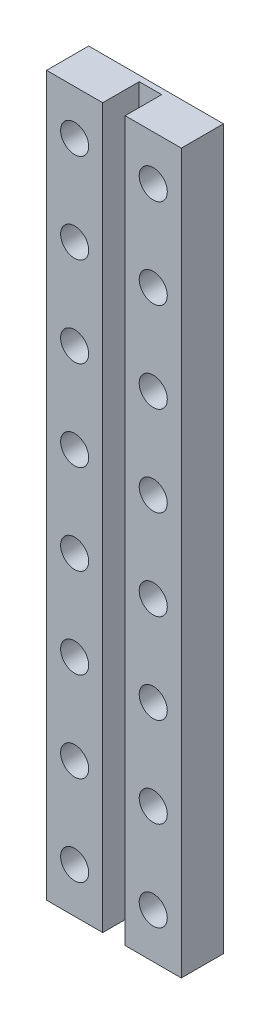
ISO-10303-21;
HEADER;
FILE_DESCRIPTION(('STEP AP214'),'2;1');
FILE_NAME('part.step','',(''),(''),'','','');
FILE_SCHEMA(('AUTOMOTIVE_DESIGN { 1 0 10303 214 1 1 1 1 }'));
ENDSEC;
DATA;
#1=APPLICATION_CONTEXT('core data for automotive mechanical design processes');
#2=APPLICATION_PROTOCOL_DEFINITION('international standard','automotive_design',2000,#1);
#3=PRODUCT_CONTEXT('',#1,'mechanical');
#4=PRODUCT('Part','Part','',(#3));
#5=PRODUCT_RELATED_PRODUCT_CATEGORY('part','',(#4));
#6=PRODUCT_DEFINITION_FORMATION('','',#4);
#7=PRODUCT_DEFINITION_CONTEXT('part definition',#1,'design');
#8=PRODUCT_DEFINITION('design','',#6,#7);
#9=PRODUCT_DEFINITION_SHAPE('','',#8);
#10=(LENGTH_UNIT() NAMED_UNIT(*) SI_UNIT(.MILLI.,.METRE.));
#11=(NAMED_UNIT(*) PLANE_ANGLE_UNIT() SI_UNIT($,.RADIAN.));
#12=(NAMED_UNIT(*) SI_UNIT($,.STERADIAN.) SOLID_ANGLE_UNIT());
#13=UNCERTAINTY_MEASURE_WITH_UNIT(LENGTH_MEASURE(1.E-05),#10,'distance_accuracy_value','');
#14=(GEOMETRIC_REPRESENTATION_CONTEXT(3) GLOBAL_UNCERTAINTY_ASSIGNED_CONTEXT((#13)) GLOBAL_UNIT_ASSIGNED_CONTEXT((#10,
#11,#12)) REPRESENTATION_CONTEXT('',''));
#15=CARTESIAN_POINT('',(0.,0.,0.));
#16=DIRECTION('',(0.,0.,1.));
#17=DIRECTION('',(1.,0.,0.));
#18=AXIS2_PLACEMENT_3D('',#15,#16,#17);
#19=CARTESIAN_POINT('',(-2.,-128.,3.75));
#20=DIRECTION('',(0.,0.,1.));
#21=DIRECTION('',(1.,0.,0.));
#22=AXIS2_PLACEMENT_3D('',#19,#20,#21);
#23=PLANE('',#22);
#24=CARTESIAN_POINT('',(-6.99999999999882,-120.,3.75));
#25=DIRECTION('',(0.,0.,1.));
#26=DIRECTION('',(1.,0.,0.));
#27=AXIS2_PLACEMENT_3D('',#24,#25,#26);
#28=CIRCLE('',#27,2.5);
#29=CARTESIAN_POINT('',(-4.49999999999883,-120.,3.75));
#30=VERTEX_POINT('',#29);
#31=EDGE_CURVE('E268',#30,#30,#28,.T.);
#32=ORIENTED_EDGE('',*,*,#31,.F.);
#33=EDGE_LOOP('',(#32));
#34=FACE_BOUND('',#33,.T.);
#35=CARTESIAN_POINT('',(-6.99999999999899,-104.,3.75));
#36=DIRECTION('',(0.,0.,1.));
#37=DIRECTION('',(1.,0.,0.));
#38=AXIS2_PLACEMENT_3D('',#35,#36,#37);
#39=CIRCLE('',#38,2.5);
#40=CARTESIAN_POINT('',(-4.49999999999899,-104.,3.75));
#41=VERTEX_POINT('',#40);
#42=EDGE_CURVE('E270',#41,#41,#39,.T.);
#43=ORIENTED_EDGE('',*,*,#42,.F.);
#44=EDGE_LOOP('',(#43));
#45=FACE_BOUND('',#44,.T.);
#46=CARTESIAN_POINT('',(-6.99999999999916,-88.,3.75));
#47=DIRECTION('',(0.,0.,1.));
#48=DIRECTION('',(1.,0.,0.));
#49=AXIS2_PLACEMENT_3D('',#46,#47,#48);
#50=CIRCLE('',#49,2.5);
#51=CARTESIAN_POINT('',(-4.49999999999916,-88.,3.75));
#52=VERTEX_POINT('',#51);
#53=EDGE_CURVE('E276',#52,#52,#50,.T.);
#54=ORIENTED_EDGE('',*,*,#53,.F.);
#55=EDGE_LOOP('',(#54));
#56=FACE_BOUND('',#55,.T.);
#57=CARTESIAN_POINT('',(-6.99999999999933,-72.,3.75));
#58=DIRECTION('',(0.,0.,1.));
#59=DIRECTION('',(1.,0.,0.));
#60=AXIS2_PLACEMENT_3D('',#57,#58,#59);
#61=CIRCLE('',#60,2.5);
#62=CARTESIAN_POINT('',(-4.49999999999933,-72.,3.75));
#63=VERTEX_POINT('',#62);
#64=EDGE_CURVE('E282',#63,#63,#61,.T.);
#65=ORIENTED_EDGE('',*,*,#64,.F.);
#66=EDGE_LOOP('',(#65));
#67=FACE_BOUND('',#66,.T.);
#68=CARTESIAN_POINT('',(-6.99999999999949,-56.,3.75));
#69=DIRECTION('',(0.,0.,1.));
#70=DIRECTION('',(1.,0.,0.));
#71=AXIS2_PLACEMENT_3D('',#68,#69,#70);
#72=CIRCLE('',#71,2.5);
#73=CARTESIAN_POINT('',(-4.49999999999949,-56.,3.75));
#74=VERTEX_POINT('',#73);
#75=EDGE_CURVE('E288',#74,#74,#72,.T.);
#76=ORIENTED_EDGE('',*,*,#75,.F.);
#77=EDGE_LOOP('',(#76));
#78=FACE_BOUND('',#77,.T.);
#79=CARTESIAN_POINT('',(-6.99999999999966,-40.,3.75));
#80=DIRECTION('',(0.,0.,1.));
#81=DIRECTION('',(1.,0.,0.));
#82=AXIS2_PLACEMENT_3D('',#79,#80,#81);
#83=CIRCLE('',#82,2.5);
#84=CARTESIAN_POINT('',(-4.49999999999966,-40.,3.75));
#85=VERTEX_POINT('',#84);
#86=EDGE_CURVE('E294',#85,#85,#83,.T.);
#87=ORIENTED_EDGE('',*,*,#86,.F.);
#88=EDGE_LOOP('',(#87));
#89=FACE_BOUND('',#88,.T.);
#90=CARTESIAN_POINT('',(-6.99999999999983,-24.,3.75));
#91=DIRECTION('',(0.,0.,1.));
#92=DIRECTION('',(1.,0.,0.));
#93=AXIS2_PLACEMENT_3D('',#90,#91,#92);
#94=CIRCLE('',#93,2.5);
#95=CARTESIAN_POINT('',(-4.49999999999983,-24.,3.75));
#96=VERTEX_POINT('',#95);
#97=EDGE_CURVE('E300',#96,#96,#94,.T.);
#98=ORIENTED_EDGE('',*,*,#97,.F.);
#99=EDGE_LOOP('',(#98));
#100=FACE_BOUND('',#99,.T.);
#101=CARTESIAN_POINT('',(-7.,-8.,3.75));
#102=DIRECTION('',(0.,0.,1.));
#103=DIRECTION('',(1.,0.,0.));
#104=AXIS2_PLACEMENT_3D('',#101,#102,#103);
#105=CIRCLE('',#104,2.5);
#106=CARTESIAN_POINT('',(-4.5,-8.,3.75));
#107=VERTEX_POINT('',#106);
#108=EDGE_CURVE('E354',#107,#107,#105,.T.);
#109=ORIENTED_EDGE('',*,*,#108,.F.);
#110=EDGE_LOOP('',(#109));
#111=FACE_BOUND('',#110,.T.);
#112=DIRECTION('',(1.,0.,0.));
#113=VECTOR('',#112,1.);
#114=CARTESIAN_POINT('',(-2.,0.,3.75));
#115=LINE('',#114,#113);
#116=CARTESIAN_POINT('',(-12.,0.,3.75));
#117=VERTEX_POINT('',#116);
#118=CARTESIAN_POINT('',(-2.,0.,3.75));
#119=VERTEX_POINT('',#118);
#120=EDGE_CURVE('E130',#117,#119,#115,.T.);
#121=ORIENTED_EDGE('',*,*,#120,.F.);
#122=DIRECTION('',(0.,1.,0.));
#123=VECTOR('',#122,1.);
#124=CARTESIAN_POINT('',(-12.,-128.,3.75));
#125=LINE('',#124,#123);
#126=CARTESIAN_POINT('',(-12.,-128.,3.75));
#127=VERTEX_POINT('',#126);
#128=EDGE_CURVE('E11',#127,#117,#125,.T.);
#129=ORIENTED_EDGE('',*,*,#128,.F.);
#130=DIRECTION('',(1.,0.,0.));
#131=VECTOR('',#130,1.);
#132=CARTESIAN_POINT('',(-2.,-128.,3.75));
#133=LINE('',#132,#131);
#134=CARTESIAN_POINT('',(-2.,-128.,3.75));
#135=VERTEX_POINT('',#134);
#136=EDGE_CURVE('E151',#127,#135,#133,.T.);
#137=ORIENTED_EDGE('',*,*,#136,.T.);
#138=DIRECTION('',(0.,1.,0.));
#139=VECTOR('',#138,1.);
#140=CARTESIAN_POINT('',(-2.,-128.,3.75));
#141=LINE('',#140,#139);
#142=EDGE_CURVE('E36',#135,#119,#141,.T.);
#143=ORIENTED_EDGE('',*,*,#142,.T.);
#144=EDGE_LOOP('',(#121,#129,#137,#143));
#145=FACE_BOUND('',#144,.T.);
#146=ADVANCED_FACE('F33',(#34,#45,#56,#67,#78,#89,#100,#111,#145),#23,.T.);
#147=CARTESIAN_POINT('',(-12.,-128.,-3.75));
#148=DIRECTION('',(-1.,0.,0.));
#149=DIRECTION('',(0.,0.,1.));
#150=AXIS2_PLACEMENT_3D('',#147,#148,#149);
#151=PLANE('',#150);
#152=DIRECTION('',(0.,0.,1.));
#153=VECTOR('',#152,1.);
#154=CARTESIAN_POINT('',(-12.,0.,-3.75));
#155=LINE('',#154,#153);
#156=CARTESIAN_POINT('',(-12.,0.,-3.75));
#157=VERTEX_POINT('',#156);
#158=EDGE_CURVE('E149',#157,#117,#155,.T.);
#159=ORIENTED_EDGE('',*,*,#158,.F.);
#160=DIRECTION('',(0.,1.,0.));
#161=VECTOR('',#160,1.);
#162=CARTESIAN_POINT('',(-12.,-128.,-3.75));
#163=LINE('',#162,#161);
#164=CARTESIAN_POINT('',(-12.,-128.,-3.75));
#165=VERTEX_POINT('',#164);
#166=EDGE_CURVE('E42',#165,#157,#163,.T.);
#167=ORIENTED_EDGE('',*,*,#166,.F.);
#168=DIRECTION('',(0.,0.,1.));
#169=VECTOR('',#168,1.);
#170=CARTESIAN_POINT('',(-12.,-128.,-3.75));
#171=LINE('',#170,#169);
#172=EDGE_CURVE('E120',#165,#127,#171,.T.);
#173=ORIENTED_EDGE('',*,*,#172,.T.);
#174=ORIENTED_EDGE('',*,*,#128,.T.);
#175=EDGE_LOOP('',(#159,#167,#173,#174));
#176=FACE_BOUND('',#175,.T.);
#177=ADVANCED_FACE('F163',(#176),#151,.T.);
#178=CARTESIAN_POINT('',(12.,-128.,-3.75));
#179=DIRECTION('',(0.,0.,-1.));
#180=DIRECTION('',(-1.,0.,0.));
#181=AXIS2_PLACEMENT_3D('',#178,#179,#180);
#182=PLANE('',#181);
#183=CARTESIAN_POINT('',(-6.99999999999882,-120.,-3.75));
#184=DIRECTION('',(0.,0.,1.));
#185=DIRECTION('',(1.,0.,0.));
#186=AXIS2_PLACEMENT_3D('',#183,#184,#185);
#187=CIRCLE('',#186,2.5);
#188=CARTESIAN_POINT('',(-4.49999999999883,-120.,-3.75));
#189=VERTEX_POINT('',#188);
#190=EDGE_CURVE('E265',#189,#189,#187,.T.);
#191=ORIENTED_EDGE('',*,*,#190,.T.);
#192=EDGE_LOOP('',(#191));
#193=FACE_BOUND('',#192,.T.);
#194=CARTESIAN_POINT('',(-6.99999999999899,-104.,-3.75));
#195=DIRECTION('',(0.,0.,1.));
#196=DIRECTION('',(1.,0.,0.));
#197=AXIS2_PLACEMENT_3D('',#194,#195,#196);
#198=CIRCLE('',#197,2.5);
#199=CARTESIAN_POINT('',(-4.49999999999899,-104.,-3.75));
#200=VERTEX_POINT('',#199);
#201=EDGE_CURVE('E273',#200,#200,#198,.T.);
#202=ORIENTED_EDGE('',*,*,#201,.T.);
#203=EDGE_LOOP('',(#202));
#204=FACE_BOUND('',#203,.T.);
#205=CARTESIAN_POINT('',(-6.99999999999916,-88.,-3.75));
#206=DIRECTION('',(0.,0.,1.));
#207=DIRECTION('',(1.,0.,0.));
#208=AXIS2_PLACEMENT_3D('',#205,#206,#207);
#209=CIRCLE('',#208,2.5);
#210=CARTESIAN_POINT('',(-4.49999999999916,-88.,-3.75));
#211=VERTEX_POINT('',#210);
#212=EDGE_CURVE('E279',#211,#211,#209,.T.);
#213=ORIENTED_EDGE('',*,*,#212,.T.);
#214=EDGE_LOOP('',(#213));
#215=FACE_BOUND('',#214,.T.);
#216=CARTESIAN_POINT('',(-6.99999999999933,-72.,-3.75));
#217=DIRECTION('',(0.,0.,1.));
#218=DIRECTION('',(1.,0.,0.));
#219=AXIS2_PLACEMENT_3D('',#216,#217,#218);
#220=CIRCLE('',#219,2.5);
#221=CARTESIAN_POINT('',(-4.49999999999933,-72.,-3.75));
#222=VERTEX_POINT('',#221);
#223=EDGE_CURVE('E285',#222,#222,#220,.T.);
#224=ORIENTED_EDGE('',*,*,#223,.T.);
#225=EDGE_LOOP('',(#224));
#226=FACE_BOUND('',#225,.T.);
#227=CARTESIAN_POINT('',(-6.99999999999949,-56.,-3.75));
#228=DIRECTION('',(0.,0.,1.));
#229=DIRECTION('',(1.,0.,0.));
#230=AXIS2_PLACEMENT_3D('',#227,#228,#229);
#231=CIRCLE('',#230,2.5);
#232=CARTESIAN_POINT('',(-4.49999999999949,-56.,-3.75));
#233=VERTEX_POINT('',#232);
#234=EDGE_CURVE('E291',#233,#233,#231,.T.);
#235=ORIENTED_EDGE('',*,*,#234,.T.);
#236=EDGE_LOOP('',(#235));
#237=FACE_BOUND('',#236,.T.);
#238=CARTESIAN_POINT('',(-6.99999999999966,-40.,-3.75));
#239=DIRECTION('',(0.,0.,1.));
#240=DIRECTION('',(1.,0.,0.));
#241=AXIS2_PLACEMENT_3D('',#238,#239,#240);
#242=CIRCLE('',#241,2.5);
#243=CARTESIAN_POINT('',(-4.49999999999966,-40.,-3.75));
#244=VERTEX_POINT('',#243);
#245=EDGE_CURVE('E297',#244,#244,#242,.T.);
#246=ORIENTED_EDGE('',*,*,#245,.T.);
#247=EDGE_LOOP('',(#246));
#248=FACE_BOUND('',#247,.T.);
#249=CARTESIAN_POINT('',(-6.99999999999983,-24.,-3.75));
#250=DIRECTION('',(0.,0.,1.));
#251=DIRECTION('',(1.,0.,0.));
#252=AXIS2_PLACEMENT_3D('',#249,#250,#251);
#253=CIRCLE('',#252,2.5);
#254=CARTESIAN_POINT('',(-4.49999999999983,-24.,-3.75));
#255=VERTEX_POINT('',#254);
#256=EDGE_CURVE('E303',#255,#255,#253,.T.);
#257=ORIENTED_EDGE('',*,*,#256,.T.);
#258=EDGE_LOOP('',(#257));
#259=FACE_BOUND('',#258,.T.);
#260=CARTESIAN_POINT('',(7.00000000000118,-120.,-3.75));
#261=DIRECTION('',(0.,0.,1.));
#262=DIRECTION('',(1.,0.,0.));
#263=AXIS2_PLACEMENT_3D('',#260,#261,#262);
#264=CIRCLE('',#263,2.5);
#265=CARTESIAN_POINT('',(9.50000000000117,-120.,-3.75));
#266=VERTEX_POINT('',#265);
#267=EDGE_CURVE('E309',#266,#266,#264,.T.);
#268=ORIENTED_EDGE('',*,*,#267,.T.);
#269=EDGE_LOOP('',(#268));
#270=FACE_BOUND('',#269,.T.);
#271=CARTESIAN_POINT('',(7.00000000000101,-104.,-3.75));
#272=DIRECTION('',(0.,0.,1.));
#273=DIRECTION('',(1.,0.,0.));
#274=AXIS2_PLACEMENT_3D('',#271,#272,#273);
#275=CIRCLE('',#274,2.5);
#276=CARTESIAN_POINT('',(9.50000000000101,-104.,-3.75));
#277=VERTEX_POINT('',#276);
#278=EDGE_CURVE('E315',#277,#277,#275,.T.);
#279=ORIENTED_EDGE('',*,*,#278,.T.);
#280=EDGE_LOOP('',(#279));
#281=FACE_BOUND('',#280,.T.);
#282=CARTESIAN_POINT('',(7.00000000000084,-88.,-3.75));
#283=DIRECTION('',(0.,0.,1.));
#284=DIRECTION('',(1.,0.,0.));
#285=AXIS2_PLACEMENT_3D('',#282,#283,#284);
#286=CIRCLE('',#285,2.5);
#287=CARTESIAN_POINT('',(9.50000000000084,-88.,-3.75));
#288=VERTEX_POINT('',#287);
#289=EDGE_CURVE('E321',#288,#288,#286,.T.);
#290=ORIENTED_EDGE('',*,*,#289,.T.);
#291=EDGE_LOOP('',(#290));
#292=FACE_BOUND('',#291,.T.);
#293=CARTESIAN_POINT('',(7.00000000000067,-72.,-3.75));
#294=DIRECTION('',(0.,0.,1.));
#295=DIRECTION('',(1.,0.,0.));
#296=AXIS2_PLACEMENT_3D('',#293,#294,#295);
#297=CIRCLE('',#296,2.5);
#298=CARTESIAN_POINT('',(9.50000000000067,-72.,-3.75));
#299=VERTEX_POINT('',#298);
#300=EDGE_CURVE('E327',#299,#299,#297,.T.);
#301=ORIENTED_EDGE('',*,*,#300,.T.);
#302=EDGE_LOOP('',(#301));
#303=FACE_BOUND('',#302,.T.);
#304=CARTESIAN_POINT('',(7.00000000000051,-56.,-3.75));
#305=DIRECTION('',(0.,0.,1.));
#306=DIRECTION('',(1.,0.,0.));
#307=AXIS2_PLACEMENT_3D('',#304,#305,#306);
#308=CIRCLE('',#307,2.5);
#309=CARTESIAN_POINT('',(9.5000000000005,-56.,-3.75));
#310=VERTEX_POINT('',#309);
#311=EDGE_CURVE('E333',#310,#310,#308,.T.);
#312=ORIENTED_EDGE('',*,*,#311,.T.);
#313=EDGE_LOOP('',(#312));
#314=FACE_BOUND('',#313,.T.);
#315=CARTESIAN_POINT('',(7.00000000000034,-40.,-3.75));
#316=DIRECTION('',(0.,0.,1.));
#317=DIRECTION('',(1.,0.,0.));
#318=AXIS2_PLACEMENT_3D('',#315,#316,#317);
#319=CIRCLE('',#318,2.5);
#320=CARTESIAN_POINT('',(9.50000000000034,-40.,-3.75));
#321=VERTEX_POINT('',#320);
#322=EDGE_CURVE('E339',#321,#321,#319,.T.);
#323=ORIENTED_EDGE('',*,*,#322,.T.);
#324=EDGE_LOOP('',(#323));
#325=FACE_BOUND('',#324,.T.);
#326=CARTESIAN_POINT('',(7.00000000000017,-24.,-3.75));
#327=DIRECTION('',(0.,0.,1.));
#328=DIRECTION('',(1.,0.,0.));
#329=AXIS2_PLACEMENT_3D('',#326,#327,#328);
#330=CIRCLE('',#329,2.5);
#331=CARTESIAN_POINT('',(9.50000000000017,-24.,-3.75));
#332=VERTEX_POINT('',#331);
#333=EDGE_CURVE('E345',#332,#332,#330,.T.);
#334=ORIENTED_EDGE('',*,*,#333,.T.);
#335=EDGE_LOOP('',(#334));
#336=FACE_BOUND('',#335,.T.);
#337=CARTESIAN_POINT('',(7.,-8.,-3.75));
#338=DIRECTION('',(0.,0.,1.));
#339=DIRECTION('',(1.,0.,0.));
#340=AXIS2_PLACEMENT_3D('',#337,#338,#339);
#341=CIRCLE('',#340,2.5);
#342=CARTESIAN_POINT('',(9.5,-8.,-3.75));
#343=VERTEX_POINT('',#342);
#344=EDGE_CURVE('E351',#343,#343,#341,.T.);
#345=ORIENTED_EDGE('',*,*,#344,.T.);
#346=EDGE_LOOP('',(#345));
#347=FACE_BOUND('',#346,.T.);
#348=CARTESIAN_POINT('',(-7.,-8.,-3.75));
#349=DIRECTION('',(0.,0.,1.));
#350=DIRECTION('',(1.,0.,0.));
#351=AXIS2_PLACEMENT_3D('',#348,#349,#350);
#352=CIRCLE('',#351,2.5);
#353=CARTESIAN_POINT('',(-4.5,-8.,-3.75));
#354=VERTEX_POINT('',#353);
#355=EDGE_CURVE('E134',#354,#354,#352,.T.);
#356=ORIENTED_EDGE('',*,*,#355,.T.);
#357=EDGE_LOOP('',(#356));
#358=FACE_BOUND('',#357,.T.);
#359=DIRECTION('',(-1.,0.,0.));
#360=VECTOR('',#359,1.);
#361=CARTESIAN_POINT('',(12.,0.,-3.75));
#362=LINE('',#361,#360);
#363=CARTESIAN_POINT('',(12.,0.,-3.75));
#364=VERTEX_POINT('',#363);
#365=EDGE_CURVE('E107',#364,#157,#362,.T.);
#366=ORIENTED_EDGE('',*,*,#365,.F.);
#367=DIRECTION('',(0.,1.,0.));
#368=VECTOR('',#367,1.);
#369=CARTESIAN_POINT('',(12.,-128.,-3.75));
#370=LINE('',#369,#368);
#371=CARTESIAN_POINT('',(12.,-128.,-3.75));
#372=VERTEX_POINT('',#371);
#373=EDGE_CURVE('E102',#372,#364,#370,.T.);
#374=ORIENTED_EDGE('',*,*,#373,.F.);
#375=DIRECTION('',(-1.,0.,0.));
#376=VECTOR('',#375,1.);
#377=CARTESIAN_POINT('',(12.,-128.,-3.75));
#378=LINE('',#377,#376);
#379=EDGE_CURVE('E105',#372,#165,#378,.T.);
#380=ORIENTED_EDGE('',*,*,#379,.T.);
#381=ORIENTED_EDGE('',*,*,#166,.T.);
#382=EDGE_LOOP('',(#366,#374,#380,#381));
#383=FACE_BOUND('',#382,.T.);
#384=ADVANCED_FACE('F104',(#193,#204,#215,#226,#237,#248,#259,#270,#281,#292,#303,#314,#325,
#336,#347,#358,#383),#182,.T.);
#385=CARTESIAN_POINT('',(12.,-128.,-3.75));
#386=DIRECTION('',(1.,0.,0.));
#387=DIRECTION('',(0.,0.,-1.));
#388=AXIS2_PLACEMENT_3D('',#385,#386,#387);
#389=PLANE('',#388);
#390=DIRECTION('',(0.,0.,-1.));
#391=VECTOR('',#390,1.);
#392=CARTESIAN_POINT('',(12.,0.,-3.75));
#393=LINE('',#392,#391);
#394=CARTESIAN_POINT('',(12.,0.,3.75));
#395=VERTEX_POINT('',#394);
#396=EDGE_CURVE('E146',#395,#364,#393,.T.);
#397=ORIENTED_EDGE('',*,*,#396,.F.);
#398=DIRECTION('',(0.,1.,0.));
#399=VECTOR('',#398,1.);
#400=CARTESIAN_POINT('',(12.,-128.,3.75));
#401=LINE('',#400,#399);
#402=CARTESIAN_POINT('',(12.,-128.,3.75));
#403=VERTEX_POINT('',#402);
#404=EDGE_CURVE('E112',#403,#395,#401,.T.);
#405=ORIENTED_EDGE('',*,*,#404,.F.);
#406=DIRECTION('',(0.,0.,-1.));
#407=VECTOR('',#406,1.);
#408=CARTESIAN_POINT('',(12.,-128.,-3.75));
#409=LINE('',#408,#407);
#410=EDGE_CURVE('E118',#403,#372,#409,.T.);
#411=ORIENTED_EDGE('',*,*,#410,.T.);
#412=ORIENTED_EDGE('',*,*,#373,.T.);
#413=EDGE_LOOP('',(#397,#405,#411,#412));
#414=FACE_BOUND('',#413,.T.);
#415=ADVANCED_FACE('F122',(#414),#389,.T.);
#416=CARTESIAN_POINT('',(12.,-128.,3.75));
#417=DIRECTION('',(0.,0.,1.));
#418=DIRECTION('',(1.,0.,0.));
#419=AXIS2_PLACEMENT_3D('',#416,#417,#418);
#420=PLANE('',#419);
#421=CARTESIAN_POINT('',(7.00000000000118,-120.,3.75));
#422=DIRECTION('',(0.,0.,1.));
#423=DIRECTION('',(1.,0.,0.));
#424=AXIS2_PLACEMENT_3D('',#421,#422,#423);
#425=CIRCLE('',#424,2.5);
#426=CARTESIAN_POINT('',(9.50000000000117,-120.,3.75));
#427=VERTEX_POINT('',#426);
#428=EDGE_CURVE('E306',#427,#427,#425,.T.);
#429=ORIENTED_EDGE('',*,*,#428,.F.);
#430=EDGE_LOOP('',(#429));
#431=FACE_BOUND('',#430,.T.);
#432=CARTESIAN_POINT('',(7.00000000000101,-104.,3.75));
#433=DIRECTION('',(0.,0.,1.));
#434=DIRECTION('',(1.,0.,0.));
#435=AXIS2_PLACEMENT_3D('',#432,#433,#434);
#436=CIRCLE('',#435,2.5);
#437=CARTESIAN_POINT('',(9.50000000000101,-104.,3.75));
#438=VERTEX_POINT('',#437);
#439=EDGE_CURVE('E312',#438,#438,#436,.T.);
#440=ORIENTED_EDGE('',*,*,#439,.F.);
#441=EDGE_LOOP('',(#440));
#442=FACE_BOUND('',#441,.T.);
#443=CARTESIAN_POINT('',(7.00000000000084,-88.,3.75));
#444=DIRECTION('',(0.,0.,1.));
#445=DIRECTION('',(1.,0.,0.));
#446=AXIS2_PLACEMENT_3D('',#443,#444,#445);
#447=CIRCLE('',#446,2.5);
#448=CARTESIAN_POINT('',(9.50000000000084,-88.,3.75));
#449=VERTEX_POINT('',#448);
#450=EDGE_CURVE('E318',#449,#449,#447,.T.);
#451=ORIENTED_EDGE('',*,*,#450,.F.);
#452=EDGE_LOOP('',(#451));
#453=FACE_BOUND('',#452,.T.);
#454=CARTESIAN_POINT('',(7.00000000000067,-72.,3.75));
#455=DIRECTION('',(0.,0.,1.));
#456=DIRECTION('',(1.,0.,0.));
#457=AXIS2_PLACEMENT_3D('',#454,#455,#456);
#458=CIRCLE('',#457,2.5);
#459=CARTESIAN_POINT('',(9.50000000000067,-72.,3.75));
#460=VERTEX_POINT('',#459);
#461=EDGE_CURVE('E324',#460,#460,#458,.T.);
#462=ORIENTED_EDGE('',*,*,#461,.F.);
#463=EDGE_LOOP('',(#462));
#464=FACE_BOUND('',#463,.T.);
#465=CARTESIAN_POINT('',(7.00000000000051,-56.,3.75));
#466=DIRECTION('',(0.,0.,1.));
#467=DIRECTION('',(1.,0.,0.));
#468=AXIS2_PLACEMENT_3D('',#465,#466,#467);
#469=CIRCLE('',#468,2.5);
#470=CARTESIAN_POINT('',(9.5000000000005,-56.,3.75));
#471=VERTEX_POINT('',#470);
#472=EDGE_CURVE('E330',#471,#471,#469,.T.);
#473=ORIENTED_EDGE('',*,*,#472,.F.);
#474=EDGE_LOOP('',(#473));
#475=FACE_BOUND('',#474,.T.);
#476=CARTESIAN_POINT('',(7.00000000000034,-40.,3.75));
#477=DIRECTION('',(0.,0.,1.));
#478=DIRECTION('',(1.,0.,0.));
#479=AXIS2_PLACEMENT_3D('',#476,#477,#478);
#480=CIRCLE('',#479,2.5);
#481=CARTESIAN_POINT('',(9.50000000000034,-40.,3.75));
#482=VERTEX_POINT('',#481);
#483=EDGE_CURVE('E336',#482,#482,#480,.T.);
#484=ORIENTED_EDGE('',*,*,#483,.F.);
#485=EDGE_LOOP('',(#484));
#486=FACE_BOUND('',#485,.T.);
#487=CARTESIAN_POINT('',(7.00000000000017,-24.,3.75));
#488=DIRECTION('',(0.,0.,1.));
#489=DIRECTION('',(1.,0.,0.));
#490=AXIS2_PLACEMENT_3D('',#487,#488,#489);
#491=CIRCLE('',#490,2.5);
#492=CARTESIAN_POINT('',(9.50000000000017,-24.,3.75));
#493=VERTEX_POINT('',#492);
#494=EDGE_CURVE('E342',#493,#493,#491,.T.);
#495=ORIENTED_EDGE('',*,*,#494,.F.);
#496=EDGE_LOOP('',(#495));
#497=FACE_BOUND('',#496,.T.);
#498=CARTESIAN_POINT('',(7.,-8.,3.75));
#499=DIRECTION('',(0.,0.,1.));
#500=DIRECTION('',(1.,0.,0.));
#501=AXIS2_PLACEMENT_3D('',#498,#499,#500);
#502=CIRCLE('',#501,2.5);
#503=CARTESIAN_POINT('',(9.5,-8.,3.75));
#504=VERTEX_POINT('',#503);
#505=EDGE_CURVE('E348',#504,#504,#502,.T.);
#506=ORIENTED_EDGE('',*,*,#505,.F.);
#507=EDGE_LOOP('',(#506));
#508=FACE_BOUND('',#507,.T.);
#509=DIRECTION('',(1.,0.,0.));
#510=VECTOR('',#509,1.);
#511=CARTESIAN_POINT('',(12.,0.,3.75));
#512=LINE('',#511,#510);
#513=CARTESIAN_POINT('',(2.,0.,3.75));
#514=VERTEX_POINT('',#513);
#515=EDGE_CURVE('E143',#514,#395,#512,.T.);
#516=ORIENTED_EDGE('',*,*,#515,.F.);
#517=DIRECTION('',(0.,1.,0.));
#518=VECTOR('',#517,1.);
#519=CARTESIAN_POINT('',(2.,-128.,3.75));
#520=LINE('',#519,#518);
#521=CARTESIAN_POINT('',(2.,-128.,3.75));
#522=VERTEX_POINT('',#521);
#523=EDGE_CURVE('E155',#522,#514,#520,.T.);
#524=ORIENTED_EDGE('',*,*,#523,.F.);
#525=DIRECTION('',(1.,0.,0.));
#526=VECTOR('',#525,1.);
#527=CARTESIAN_POINT('',(12.,-128.,3.75));
#528=LINE('',#527,#526);
#529=EDGE_CURVE('E123',#522,#403,#528,.T.);
#530=ORIENTED_EDGE('',*,*,#529,.T.);
#531=ORIENTED_EDGE('',*,*,#404,.T.);
#532=EDGE_LOOP('',(#516,#524,#530,#531));
#533=FACE_BOUND('',#532,.T.);
#534=ADVANCED_FACE('F178',(#431,#442,#453,#464,#475,#486,#497,#508,#533),#420,.T.);
#535=CARTESIAN_POINT('',(2.,-128.,-2.75));
#536=DIRECTION('',(-1.,0.,0.));
#537=DIRECTION('',(0.,0.,1.));
#538=AXIS2_PLACEMENT_3D('',#535,#536,#537);
#539=PLANE('',#538);
#540=DIRECTION('',(0.,0.,1.));
#541=VECTOR('',#540,1.);
#542=CARTESIAN_POINT('',(2.,0.,-2.75));
#543=LINE('',#542,#541);
#544=CARTESIAN_POINT('',(2.,0.,-2.75));
#545=VERTEX_POINT('',#544);
#546=EDGE_CURVE('E140',#545,#514,#543,.T.);
#547=ORIENTED_EDGE('',*,*,#546,.F.);
#548=DIRECTION('',(0.,1.,0.));
#549=VECTOR('',#548,1.);
#550=CARTESIAN_POINT('',(2.,-128.,-2.75));
#551=LINE('',#550,#549);
#552=CARTESIAN_POINT('',(2.,-128.,-2.75));
#553=VERTEX_POINT('',#552);
#554=EDGE_CURVE('E157',#553,#545,#551,.T.);
#555=ORIENTED_EDGE('',*,*,#554,.F.);
#556=DIRECTION('',(0.,0.,1.));
#557=VECTOR('',#556,1.);
#558=CARTESIAN_POINT('',(2.,-128.,-2.75));
#559=LINE('',#558,#557);
#560=EDGE_CURVE('E125',#553,#522,#559,.T.);
#561=ORIENTED_EDGE('',*,*,#560,.T.);
#562=ORIENTED_EDGE('',*,*,#523,.T.);
#563=EDGE_LOOP('',(#547,#555,#561,#562));
#564=FACE_BOUND('',#563,.T.);
#565=ADVANCED_FACE('F181',(#564),#539,.T.);
#566=CARTESIAN_POINT('',(-2.,-128.,-2.75));
#567=DIRECTION('',(0.,0.,1.));
#568=DIRECTION('',(1.,0.,0.));
#569=AXIS2_PLACEMENT_3D('',#566,#567,#568);
#570=PLANE('',#569);
#571=DIRECTION('',(1.,0.,0.));
#572=VECTOR('',#571,1.);
#573=CARTESIAN_POINT('',(-2.,0.,-2.75));
#574=LINE('',#573,#572);
#575=CARTESIAN_POINT('',(-2.,0.,-2.75));
#576=VERTEX_POINT('',#575);
#577=EDGE_CURVE('E137',#576,#545,#574,.T.);
#578=ORIENTED_EDGE('',*,*,#577,.F.);
#579=DIRECTION('',(0.,1.,0.));
#580=VECTOR('',#579,1.);
#581=CARTESIAN_POINT('',(-2.,-128.,-2.75));
#582=LINE('',#581,#580);
#583=CARTESIAN_POINT('',(-2.,-128.,-2.75));
#584=VERTEX_POINT('',#583);
#585=EDGE_CURVE('E158',#584,#576,#582,.T.);
#586=ORIENTED_EDGE('',*,*,#585,.F.);
#587=DIRECTION('',(1.,0.,0.));
#588=VECTOR('',#587,1.);
#589=CARTESIAN_POINT('',(-2.,-128.,-2.75));
#590=LINE('',#589,#588);
#591=EDGE_CURVE('E364',#584,#553,#590,.T.);
#592=ORIENTED_EDGE('',*,*,#591,.T.);
#593=ORIENTED_EDGE('',*,*,#554,.T.);
#594=EDGE_LOOP('',(#578,#586,#592,#593));
#595=FACE_BOUND('',#594,.T.);
#596=ADVANCED_FACE('F185',(#595),#570,.T.);
#597=CARTESIAN_POINT('',(-2.,-128.,3.75));
#598=DIRECTION('',(1.,0.,0.));
#599=DIRECTION('',(0.,0.,-1.));
#600=AXIS2_PLACEMENT_3D('',#597,#598,#599);
#601=PLANE('',#600);
#602=DIRECTION('',(0.,0.,-1.));
#603=VECTOR('',#602,1.);
#604=CARTESIAN_POINT('',(-2.,0.,3.75));
#605=LINE('',#604,#603);
#606=EDGE_CURVE('E133',#119,#576,#605,.T.);
#607=ORIENTED_EDGE('',*,*,#606,.F.);
#608=ORIENTED_EDGE('',*,*,#142,.F.);
#609=DIRECTION('',(0.,0.,-1.));
#610=VECTOR('',#609,1.);
#611=CARTESIAN_POINT('',(-2.,-128.,3.75));
#612=LINE('',#611,#610);
#613=EDGE_CURVE('E362',#135,#584,#612,.T.);
#614=ORIENTED_EDGE('',*,*,#613,.T.);
#615=ORIENTED_EDGE('',*,*,#585,.T.);
#616=EDGE_LOOP('',(#607,#608,#614,#615));
#617=FACE_BOUND('',#616,.T.);
#618=ADVANCED_FACE('F160',(#617),#601,.T.);
#619=CARTESIAN_POINT('',(0.,-128.,0.));
#620=DIRECTION('',(0.,1.,0.));
#621=DIRECTION('',(0.,0.,1.));
#622=AXIS2_PLACEMENT_3D('',#619,#620,#621);
#623=PLANE('',#622);
#624=ORIENTED_EDGE('',*,*,#136,.F.);
#625=ORIENTED_EDGE('',*,*,#172,.F.);
#626=ORIENTED_EDGE('',*,*,#379,.F.);
#627=ORIENTED_EDGE('',*,*,#410,.F.);
#628=ORIENTED_EDGE('',*,*,#529,.F.);
#629=ORIENTED_EDGE('',*,*,#560,.F.);
#630=ORIENTED_EDGE('',*,*,#591,.F.);
#631=ORIENTED_EDGE('',*,*,#613,.F.);
#632=EDGE_LOOP('',(#624,#625,#626,#627,#628,#629,#630,#631));
#633=FACE_BOUND('',#632,.T.);
#634=ADVANCED_FACE('F116',(#633),#623,.F.);
#635=CARTESIAN_POINT('',(0.,0.,0.));
#636=DIRECTION('',(0.,1.,0.));
#637=DIRECTION('',(0.,0.,1.));
#638=AXIS2_PLACEMENT_3D('',#635,#636,#637);
#639=PLANE('',#638);
#640=ORIENTED_EDGE('',*,*,#120,.T.);
#641=ORIENTED_EDGE('',*,*,#606,.T.);
#642=ORIENTED_EDGE('',*,*,#577,.T.);
#643=ORIENTED_EDGE('',*,*,#546,.T.);
#644=ORIENTED_EDGE('',*,*,#515,.T.);
#645=ORIENTED_EDGE('',*,*,#396,.T.);
#646=ORIENTED_EDGE('',*,*,#365,.T.);
#647=ORIENTED_EDGE('',*,*,#158,.T.);
#648=EDGE_LOOP('',(#640,#641,#642,#643,#644,#645,#646,#647));
#649=FACE_BOUND('',#648,.T.);
#650=ADVANCED_FACE('F162',(#649),#639,.T.);
#651=CARTESIAN_POINT('',(-7.,-8.,-3.75));
#652=DIRECTION('',(0.,0.,1.));
#653=DIRECTION('',(1.,0.,0.));
#654=AXIS2_PLACEMENT_3D('',#651,#652,#653);
#655=CYLINDRICAL_SURFACE('',#654,2.5);
#656=ORIENTED_EDGE('',*,*,#355,.F.);
#657=EDGE_LOOP('',(#656));
#658=FACE_BOUND('',#657,.T.);
#659=ORIENTED_EDGE('',*,*,#108,.T.);
#660=EDGE_LOOP('',(#659));
#661=FACE_BOUND('',#660,.T.);
#662=ADVANCED_FACE('F196',(#658,#661),#655,.F.);
#663=CARTESIAN_POINT('',(7.,-8.,-3.75));
#664=DIRECTION('',(0.,0.,1.));
#665=DIRECTION('',(1.,0.,0.));
#666=AXIS2_PLACEMENT_3D('',#663,#664,#665);
#667=CYLINDRICAL_SURFACE('',#666,2.5);
#668=ORIENTED_EDGE('',*,*,#344,.F.);
#669=EDGE_LOOP('',(#668));
#670=FACE_BOUND('',#669,.T.);
#671=ORIENTED_EDGE('',*,*,#505,.T.);
#672=EDGE_LOOP('',(#671));
#673=FACE_BOUND('',#672,.T.);
#674=ADVANCED_FACE('F200',(#670,#673),#667,.F.);
#675=CARTESIAN_POINT('',(7.00000000000017,-24.,-3.75));
#676=DIRECTION('',(0.,0.,1.));
#677=DIRECTION('',(1.,0.,0.));
#678=AXIS2_PLACEMENT_3D('',#675,#676,#677);
#679=CYLINDRICAL_SURFACE('',#678,2.5);
#680=ORIENTED_EDGE('',*,*,#333,.F.);
#681=EDGE_LOOP('',(#680));
#682=FACE_BOUND('',#681,.T.);
#683=ORIENTED_EDGE('',*,*,#494,.T.);
#684=EDGE_LOOP('',(#683));
#685=FACE_BOUND('',#684,.T.);
#686=ADVANCED_FACE('F204',(#682,#685),#679,.F.);
#687=CARTESIAN_POINT('',(7.00000000000034,-40.,-3.75));
#688=DIRECTION('',(0.,0.,1.));
#689=DIRECTION('',(1.,0.,0.));
#690=AXIS2_PLACEMENT_3D('',#687,#688,#689);
#691=CYLINDRICAL_SURFACE('',#690,2.5);
#692=ORIENTED_EDGE('',*,*,#322,.F.);
#693=EDGE_LOOP('',(#692));
#694=FACE_BOUND('',#693,.T.);
#695=ORIENTED_EDGE('',*,*,#483,.T.);
#696=EDGE_LOOP('',(#695));
#697=FACE_BOUND('',#696,.T.);
#698=ADVANCED_FACE('F208',(#694,#697),#691,.F.);
#699=CARTESIAN_POINT('',(7.00000000000051,-56.,-3.75));
#700=DIRECTION('',(0.,0.,1.));
#701=DIRECTION('',(1.,0.,0.));
#702=AXIS2_PLACEMENT_3D('',#699,#700,#701);
#703=CYLINDRICAL_SURFACE('',#702,2.5);
#704=ORIENTED_EDGE('',*,*,#311,.F.);
#705=EDGE_LOOP('',(#704));
#706=FACE_BOUND('',#705,.T.);
#707=ORIENTED_EDGE('',*,*,#472,.T.);
#708=EDGE_LOOP('',(#707));
#709=FACE_BOUND('',#708,.T.);
#710=ADVANCED_FACE('F212',(#706,#709),#703,.F.);
#711=CARTESIAN_POINT('',(7.00000000000067,-72.,-3.75));
#712=DIRECTION('',(0.,0.,1.));
#713=DIRECTION('',(1.,0.,0.));
#714=AXIS2_PLACEMENT_3D('',#711,#712,#713);
#715=CYLINDRICAL_SURFACE('',#714,2.5);
#716=ORIENTED_EDGE('',*,*,#300,.F.);
#717=EDGE_LOOP('',(#716));
#718=FACE_BOUND('',#717,.T.);
#719=ORIENTED_EDGE('',*,*,#461,.T.);
#720=EDGE_LOOP('',(#719));
#721=FACE_BOUND('',#720,.T.);
#722=ADVANCED_FACE('F216',(#718,#721),#715,.F.);
#723=CARTESIAN_POINT('',(7.00000000000084,-88.,-3.75));
#724=DIRECTION('',(0.,0.,1.));
#725=DIRECTION('',(1.,0.,0.));
#726=AXIS2_PLACEMENT_3D('',#723,#724,#725);
#727=CYLINDRICAL_SURFACE('',#726,2.5);
#728=ORIENTED_EDGE('',*,*,#289,.F.);
#729=EDGE_LOOP('',(#728));
#730=FACE_BOUND('',#729,.T.);
#731=ORIENTED_EDGE('',*,*,#450,.T.);
#732=EDGE_LOOP('',(#731));
#733=FACE_BOUND('',#732,.T.);
#734=ADVANCED_FACE('F220',(#730,#733),#727,.F.);
#735=CARTESIAN_POINT('',(7.00000000000101,-104.,-3.75));
#736=DIRECTION('',(0.,0.,1.));
#737=DIRECTION('',(1.,0.,0.));
#738=AXIS2_PLACEMENT_3D('',#735,#736,#737);
#739=CYLINDRICAL_SURFACE('',#738,2.5);
#740=ORIENTED_EDGE('',*,*,#278,.F.);
#741=EDGE_LOOP('',(#740));
#742=FACE_BOUND('',#741,.T.);
#743=ORIENTED_EDGE('',*,*,#439,.T.);
#744=EDGE_LOOP('',(#743));
#745=FACE_BOUND('',#744,.T.);
#746=ADVANCED_FACE('F224',(#742,#745),#739,.F.);
#747=CARTESIAN_POINT('',(7.00000000000118,-120.,-3.75));
#748=DIRECTION('',(0.,0.,1.));
#749=DIRECTION('',(1.,0.,0.));
#750=AXIS2_PLACEMENT_3D('',#747,#748,#749);
#751=CYLINDRICAL_SURFACE('',#750,2.5);
#752=ORIENTED_EDGE('',*,*,#267,.F.);
#753=EDGE_LOOP('',(#752));
#754=FACE_BOUND('',#753,.T.);
#755=ORIENTED_EDGE('',*,*,#428,.T.);
#756=EDGE_LOOP('',(#755));
#757=FACE_BOUND('',#756,.T.);
#758=ADVANCED_FACE('F228',(#754,#757),#751,.F.);
#759=CARTESIAN_POINT('',(-6.99999999999983,-24.,-3.75));
#760=DIRECTION('',(0.,0.,1.));
#761=DIRECTION('',(1.,0.,0.));
#762=AXIS2_PLACEMENT_3D('',#759,#760,#761);
#763=CYLINDRICAL_SURFACE('',#762,2.5);
#764=ORIENTED_EDGE('',*,*,#256,.F.);
#765=EDGE_LOOP('',(#764));
#766=FACE_BOUND('',#765,.T.);
#767=ORIENTED_EDGE('',*,*,#97,.T.);
#768=EDGE_LOOP('',(#767));
#769=FACE_BOUND('',#768,.T.);
#770=ADVANCED_FACE('F232',(#766,#769),#763,.F.);
#771=CARTESIAN_POINT('',(-6.99999999999966,-40.,-3.75));
#772=DIRECTION('',(0.,0.,1.));
#773=DIRECTION('',(1.,0.,0.));
#774=AXIS2_PLACEMENT_3D('',#771,#772,#773);
#775=CYLINDRICAL_SURFACE('',#774,2.5);
#776=ORIENTED_EDGE('',*,*,#245,.F.);
#777=EDGE_LOOP('',(#776));
#778=FACE_BOUND('',#777,.T.);
#779=ORIENTED_EDGE('',*,*,#86,.T.);
#780=EDGE_LOOP('',(#779));
#781=FACE_BOUND('',#780,.T.);
#782=ADVANCED_FACE('F236',(#778,#781),#775,.F.);
#783=CARTESIAN_POINT('',(-6.99999999999949,-56.,-3.75));
#784=DIRECTION('',(0.,0.,1.));
#785=DIRECTION('',(1.,0.,0.));
#786=AXIS2_PLACEMENT_3D('',#783,#784,#785);
#787=CYLINDRICAL_SURFACE('',#786,2.5);
#788=ORIENTED_EDGE('',*,*,#234,.F.);
#789=EDGE_LOOP('',(#788));
#790=FACE_BOUND('',#789,.T.);
#791=ORIENTED_EDGE('',*,*,#75,.T.);
#792=EDGE_LOOP('',(#791));
#793=FACE_BOUND('',#792,.T.);
#794=ADVANCED_FACE('F240',(#790,#793),#787,.F.);
#795=CARTESIAN_POINT('',(-6.99999999999933,-72.,-3.75));
#796=DIRECTION('',(0.,0.,1.));
#797=DIRECTION('',(1.,0.,0.));
#798=AXIS2_PLACEMENT_3D('',#795,#796,#797);
#799=CYLINDRICAL_SURFACE('',#798,2.5);
#800=ORIENTED_EDGE('',*,*,#223,.F.);
#801=EDGE_LOOP('',(#800));
#802=FACE_BOUND('',#801,.T.);
#803=ORIENTED_EDGE('',*,*,#64,.T.);
#804=EDGE_LOOP('',(#803));
#805=FACE_BOUND('',#804,.T.);
#806=ADVANCED_FACE('F244',(#802,#805),#799,.F.);
#807=CARTESIAN_POINT('',(-6.99999999999916,-88.,-3.75));
#808=DIRECTION('',(0.,0.,1.));
#809=DIRECTION('',(1.,0.,0.));
#810=AXIS2_PLACEMENT_3D('',#807,#808,#809);
#811=CYLINDRICAL_SURFACE('',#810,2.5);
#812=ORIENTED_EDGE('',*,*,#212,.F.);
#813=EDGE_LOOP('',(#812));
#814=FACE_BOUND('',#813,.T.);
#815=ORIENTED_EDGE('',*,*,#53,.T.);
#816=EDGE_LOOP('',(#815));
#817=FACE_BOUND('',#816,.T.);
#818=ADVANCED_FACE('F248',(#814,#817),#811,.F.);
#819=CARTESIAN_POINT('',(-6.99999999999899,-104.,-3.75));
#820=DIRECTION('',(0.,0.,1.));
#821=DIRECTION('',(1.,0.,0.));
#822=AXIS2_PLACEMENT_3D('',#819,#820,#821);
#823=CYLINDRICAL_SURFACE('',#822,2.5);
#824=ORIENTED_EDGE('',*,*,#201,.F.);
#825=EDGE_LOOP('',(#824));
#826=FACE_BOUND('',#825,.T.);
#827=ORIENTED_EDGE('',*,*,#42,.T.);
#828=EDGE_LOOP('',(#827));
#829=FACE_BOUND('',#828,.T.);
#830=ADVANCED_FACE('F252',(#826,#829),#823,.F.);
#831=CARTESIAN_POINT('',(-6.99999999999882,-120.,-3.75));
#832=DIRECTION('',(0.,0.,1.));
#833=DIRECTION('',(1.,0.,0.));
#834=AXIS2_PLACEMENT_3D('',#831,#832,#833);
#835=CYLINDRICAL_SURFACE('',#834,2.5);
#836=ORIENTED_EDGE('',*,*,#190,.F.);
#837=EDGE_LOOP('',(#836));
#838=FACE_BOUND('',#837,.T.);
#839=ORIENTED_EDGE('',*,*,#31,.T.);
#840=EDGE_LOOP('',(#839));
#841=FACE_BOUND('',#840,.T.);
#842=ADVANCED_FACE('F256',(#838,#841),#835,.F.);
#843=CLOSED_SHELL('',(#146,#177,#384,#415,#534,#565,#596,#618,#634,#650,#662,#674,#686,#698,
#710,#722,#734,#746,#758,#770,#782,#794,#806,#818,#830,#842));
#844=MANIFOLD_SOLID_BREP('B2',#843);
#845=ADVANCED_BREP_SHAPE_REPRESENTATION('',(#18,#844),#14);
#846=SHAPE_DEFINITION_REPRESENTATION(#9,#845);
ENDSEC;
END-ISO-10303-21;
